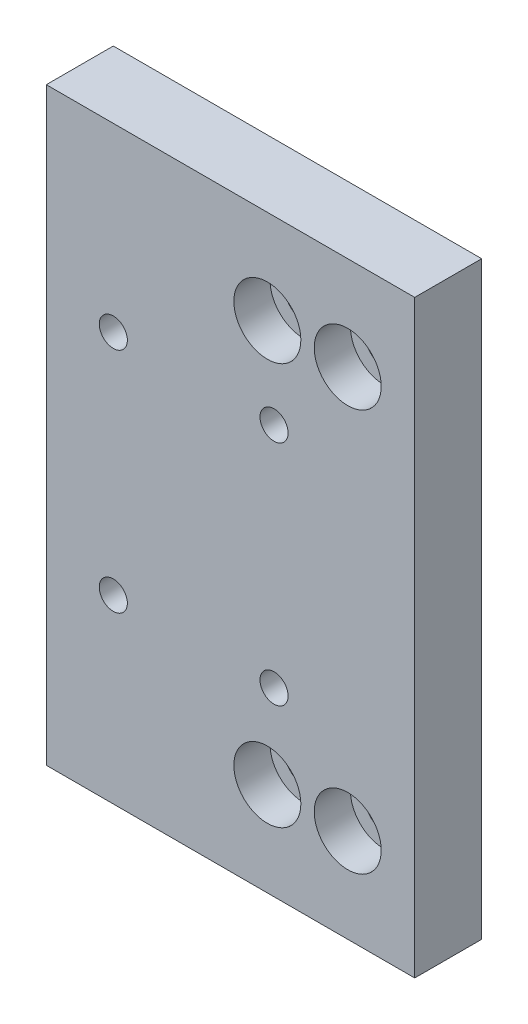
ISO-10303-21;
HEADER;
FILE_DESCRIPTION(('STEP AP214'),'2;1');
FILE_NAME('part.step','',(''),(''),'','','');
FILE_SCHEMA(('AUTOMOTIVE_DESIGN { 1 0 10303 214 1 1 1 1 }'));
ENDSEC;
DATA;
#1=APPLICATION_CONTEXT('core data for automotive mechanical design processes');
#2=APPLICATION_PROTOCOL_DEFINITION('international standard','automotive_design',2000,#1);
#3=PRODUCT_CONTEXT('',#1,'mechanical');
#4=PRODUCT('Part','Part','',(#3));
#5=PRODUCT_RELATED_PRODUCT_CATEGORY('part','',(#4));
#6=PRODUCT_DEFINITION_FORMATION('','',#4);
#7=PRODUCT_DEFINITION_CONTEXT('part definition',#1,'design');
#8=PRODUCT_DEFINITION('design','',#6,#7);
#9=PRODUCT_DEFINITION_SHAPE('','',#8);
#10=(LENGTH_UNIT() NAMED_UNIT(*) SI_UNIT(.MILLI.,.METRE.));
#11=(NAMED_UNIT(*) PLANE_ANGLE_UNIT() SI_UNIT($,.RADIAN.));
#12=(NAMED_UNIT(*) SI_UNIT($,.STERADIAN.) SOLID_ANGLE_UNIT());
#13=UNCERTAINTY_MEASURE_WITH_UNIT(LENGTH_MEASURE(1.E-05),#10,'distance_accuracy_value','');
#14=(GEOMETRIC_REPRESENTATION_CONTEXT(3) GLOBAL_UNCERTAINTY_ASSIGNED_CONTEXT((#13)) GLOBAL_UNIT_ASSIGNED_CONTEXT((#10,
#11,#12)) REPRESENTATION_CONTEXT('',''));
#15=CARTESIAN_POINT('',(0.,0.,0.));
#16=DIRECTION('',(0.,0.,1.));
#17=DIRECTION('',(1.,0.,0.));
#18=AXIS2_PLACEMENT_3D('',#15,#16,#17);
#19=CARTESIAN_POINT('',(27.5,44.,10.));
#20=DIRECTION('',(-1.,0.,0.));
#21=DIRECTION('',(0.,-1.,0.));
#22=AXIS2_PLACEMENT_3D('',#19,#20,#21);
#23=PLANE('',#22);
#24=DIRECTION('',(0.,1.,0.));
#25=VECTOR('',#24,1.);
#26=CARTESIAN_POINT('',(27.5,44.,0.));
#27=LINE('',#26,#25);
#28=CARTESIAN_POINT('',(27.5,-44.,0.));
#29=VERTEX_POINT('',#28);
#30=CARTESIAN_POINT('',(27.5,44.,0.));
#31=VERTEX_POINT('',#30);
#32=EDGE_CURVE('E115',#29,#31,#27,.T.);
#33=ORIENTED_EDGE('',*,*,#32,.T.);
#34=DIRECTION('',(0.,0.,-1.));
#35=VECTOR('',#34,1.);
#36=CARTESIAN_POINT('',(27.5,44.,10.));
#37=LINE('',#36,#35);
#38=CARTESIAN_POINT('',(27.5,44.,10.));
#39=VERTEX_POINT('',#38);
#40=EDGE_CURVE('E11',#39,#31,#37,.T.);
#41=ORIENTED_EDGE('',*,*,#40,.F.);
#42=DIRECTION('',(0.,1.,0.));
#43=VECTOR('',#42,1.);
#44=CARTESIAN_POINT('',(27.5,44.,10.));
#45=LINE('',#44,#43);
#46=CARTESIAN_POINT('',(27.5,-44.,10.));
#47=VERTEX_POINT('',#46);
#48=EDGE_CURVE('E99',#47,#39,#45,.T.);
#49=ORIENTED_EDGE('',*,*,#48,.F.);
#50=DIRECTION('',(0.,0.,-1.));
#51=VECTOR('',#50,1.);
#52=CARTESIAN_POINT('',(27.5,-44.,10.));
#53=LINE('',#52,#51);
#54=EDGE_CURVE('E111',#47,#29,#53,.T.);
#55=ORIENTED_EDGE('',*,*,#54,.T.);
#56=EDGE_LOOP('',(#33,#41,#49,#55));
#57=FACE_BOUND('',#56,.T.);
#58=ADVANCED_FACE('F47',(#57),#23,.F.);
#59=CARTESIAN_POINT('',(-27.5,44.,10.));
#60=DIRECTION('',(0.,-1.,0.));
#61=DIRECTION('',(0.,0.,-1.));
#62=AXIS2_PLACEMENT_3D('',#59,#60,#61);
#63=PLANE('',#62);
#64=DIRECTION('',(-1.,0.,0.));
#65=VECTOR('',#64,1.);
#66=CARTESIAN_POINT('',(-27.5,44.,0.));
#67=LINE('',#66,#65);
#68=CARTESIAN_POINT('',(-27.5,44.,0.));
#69=VERTEX_POINT('',#68);
#70=EDGE_CURVE('E104',#31,#69,#67,.T.);
#71=ORIENTED_EDGE('',*,*,#70,.T.);
#72=DIRECTION('',(0.,0.,-1.));
#73=VECTOR('',#72,1.);
#74=CARTESIAN_POINT('',(-27.5,44.,10.));
#75=LINE('',#74,#73);
#76=CARTESIAN_POINT('',(-27.5,44.,10.));
#77=VERTEX_POINT('',#76);
#78=EDGE_CURVE('E56',#77,#69,#75,.T.);
#79=ORIENTED_EDGE('',*,*,#78,.F.);
#80=DIRECTION('',(-1.,0.,0.));
#81=VECTOR('',#80,1.);
#82=CARTESIAN_POINT('',(-27.5,44.,10.));
#83=LINE('',#82,#81);
#84=EDGE_CURVE('E94',#39,#77,#83,.T.);
#85=ORIENTED_EDGE('',*,*,#84,.F.);
#86=ORIENTED_EDGE('',*,*,#40,.T.);
#87=EDGE_LOOP('',(#71,#79,#85,#86));
#88=FACE_BOUND('',#87,.T.);
#89=ADVANCED_FACE('F103',(#88),#63,.F.);
#90=CARTESIAN_POINT('',(-27.5,44.,10.));
#91=DIRECTION('',(1.,0.,0.));
#92=DIRECTION('',(0.,1.,0.));
#93=AXIS2_PLACEMENT_3D('',#90,#91,#92);
#94=PLANE('',#93);
#95=DIRECTION('',(0.,-1.,0.));
#96=VECTOR('',#95,1.);
#97=CARTESIAN_POINT('',(-27.5,44.,0.));
#98=LINE('',#97,#96);
#99=CARTESIAN_POINT('',(-27.5,-44.,0.));
#100=VERTEX_POINT('',#99);
#101=EDGE_CURVE('E81',#69,#100,#98,.T.);
#102=ORIENTED_EDGE('',*,*,#101,.T.);
#103=DIRECTION('',(0.,0.,-1.));
#104=VECTOR('',#103,1.);
#105=CARTESIAN_POINT('',(-27.5,-44.,10.));
#106=LINE('',#105,#104);
#107=CARTESIAN_POINT('',(-27.5,-44.,10.));
#108=VERTEX_POINT('',#107);
#109=EDGE_CURVE('E106',#108,#100,#106,.T.);
#110=ORIENTED_EDGE('',*,*,#109,.F.);
#111=DIRECTION('',(0.,-1.,0.));
#112=VECTOR('',#111,1.);
#113=CARTESIAN_POINT('',(-27.5,44.,10.));
#114=LINE('',#113,#112);
#115=EDGE_CURVE('E97',#77,#108,#114,.T.);
#116=ORIENTED_EDGE('',*,*,#115,.F.);
#117=ORIENTED_EDGE('',*,*,#78,.T.);
#118=EDGE_LOOP('',(#102,#110,#116,#117));
#119=FACE_BOUND('',#118,.T.);
#120=ADVANCED_FACE('F107',(#119),#94,.F.);
#121=CARTESIAN_POINT('',(-27.5,-44.,10.));
#122=DIRECTION('',(0.,1.,0.));
#123=DIRECTION('',(0.,0.,1.));
#124=AXIS2_PLACEMENT_3D('',#121,#122,#123);
#125=PLANE('',#124);
#126=DIRECTION('',(1.,0.,0.));
#127=VECTOR('',#126,1.);
#128=CARTESIAN_POINT('',(-27.5,-44.,0.));
#129=LINE('',#128,#127);
#130=EDGE_CURVE('E87',#100,#29,#129,.T.);
#131=ORIENTED_EDGE('',*,*,#130,.T.);
#132=ORIENTED_EDGE('',*,*,#54,.F.);
#133=DIRECTION('',(1.,0.,0.));
#134=VECTOR('',#133,1.);
#135=CARTESIAN_POINT('',(-27.5,-44.,10.));
#136=LINE('',#135,#134);
#137=EDGE_CURVE('E64',#108,#47,#136,.T.);
#138=ORIENTED_EDGE('',*,*,#137,.F.);
#139=ORIENTED_EDGE('',*,*,#109,.T.);
#140=EDGE_LOOP('',(#131,#132,#138,#139));
#141=FACE_BOUND('',#140,.T.);
#142=ADVANCED_FACE('F129',(#141),#125,.F.);
#143=CARTESIAN_POINT('',(0.,0.,10.));
#144=DIRECTION('',(0.,0.,1.));
#145=DIRECTION('',(1.,0.,0.));
#146=AXIS2_PLACEMENT_3D('',#143,#144,#145);
#147=PLANE('',#146);
#148=CARTESIAN_POINT('',(5.50000000000001,30.,10.));
#149=DIRECTION('',(0.,0.,1.));
#150=DIRECTION('',(1.,0.,0.));
#151=AXIS2_PLACEMENT_3D('',#148,#149,#150);
#152=CIRCLE('',#151,5.);
#153=CARTESIAN_POINT('',(10.5,30.,10.));
#154=VERTEX_POINT('',#153);
#155=EDGE_CURVE('E227',#154,#154,#152,.T.);
#156=ORIENTED_EDGE('',*,*,#155,.F.);
#157=EDGE_LOOP('',(#156));
#158=FACE_BOUND('',#157,.T.);
#159=CARTESIAN_POINT('',(17.5,30.,10.));
#160=DIRECTION('',(0.,0.,1.));
#161=DIRECTION('',(1.,0.,0.));
#162=AXIS2_PLACEMENT_3D('',#159,#160,#161);
#163=CIRCLE('',#162,5.);
#164=CARTESIAN_POINT('',(22.5,30.,10.));
#165=VERTEX_POINT('',#164);
#166=EDGE_CURVE('E211',#165,#165,#163,.T.);
#167=ORIENTED_EDGE('',*,*,#166,.F.);
#168=EDGE_LOOP('',(#167));
#169=FACE_BOUND('',#168,.T.);
#170=CARTESIAN_POINT('',(17.5,-30.,10.));
#171=DIRECTION('',(0.,0.,1.));
#172=DIRECTION('',(1.,0.,0.));
#173=AXIS2_PLACEMENT_3D('',#170,#171,#172);
#174=CIRCLE('',#173,5.);
#175=CARTESIAN_POINT('',(22.5,-30.,10.));
#176=VERTEX_POINT('',#175);
#177=EDGE_CURVE('E195',#176,#176,#174,.T.);
#178=ORIENTED_EDGE('',*,*,#177,.F.);
#179=EDGE_LOOP('',(#178));
#180=FACE_BOUND('',#179,.T.);
#181=CARTESIAN_POINT('',(5.50000000000001,-30.,10.));
#182=DIRECTION('',(0.,0.,1.));
#183=DIRECTION('',(1.,0.,0.));
#184=AXIS2_PLACEMENT_3D('',#181,#182,#183);
#185=CIRCLE('',#184,5.);
#186=CARTESIAN_POINT('',(10.5,-30.,10.));
#187=VERTEX_POINT('',#186);
#188=EDGE_CURVE('E179',#187,#187,#185,.T.);
#189=ORIENTED_EDGE('',*,*,#188,.F.);
#190=EDGE_LOOP('',(#189));
#191=FACE_BOUND('',#190,.T.);
#192=CARTESIAN_POINT('',(-17.5,17.,10.));
#193=DIRECTION('',(0.,0.,1.));
#194=DIRECTION('',(1.,0.,0.));
#195=AXIS2_PLACEMENT_3D('',#192,#193,#194);
#196=CIRCLE('',#195,2.09999999999999);
#197=CARTESIAN_POINT('',(-15.4,17.,10.));
#198=VERTEX_POINT('',#197);
#199=EDGE_CURVE('E163',#198,#198,#196,.T.);
#200=ORIENTED_EDGE('',*,*,#199,.F.);
#201=EDGE_LOOP('',(#200));
#202=FACE_BOUND('',#201,.T.);
#203=CARTESIAN_POINT('',(6.50000000000001,17.,10.));
#204=DIRECTION('',(0.,0.,1.));
#205=DIRECTION('',(1.,0.,0.));
#206=AXIS2_PLACEMENT_3D('',#203,#204,#205);
#207=CIRCLE('',#206,2.09999999999999);
#208=CARTESIAN_POINT('',(8.6,17.,10.));
#209=VERTEX_POINT('',#208);
#210=EDGE_CURVE('E155',#209,#209,#207,.T.);
#211=ORIENTED_EDGE('',*,*,#210,.F.);
#212=EDGE_LOOP('',(#211));
#213=FACE_BOUND('',#212,.T.);
#214=CARTESIAN_POINT('',(-17.5,-17.,10.));
#215=DIRECTION('',(0.,0.,1.));
#216=DIRECTION('',(1.,0.,0.));
#217=AXIS2_PLACEMENT_3D('',#214,#215,#216);
#218=CIRCLE('',#217,2.09999999999999);
#219=CARTESIAN_POINT('',(-15.4,-17.,10.));
#220=VERTEX_POINT('',#219);
#221=EDGE_CURVE('E147',#220,#220,#218,.T.);
#222=ORIENTED_EDGE('',*,*,#221,.F.);
#223=EDGE_LOOP('',(#222));
#224=FACE_BOUND('',#223,.T.);
#225=CARTESIAN_POINT('',(6.50000000000001,-17.,10.));
#226=DIRECTION('',(0.,0.,1.));
#227=DIRECTION('',(1.,0.,0.));
#228=AXIS2_PLACEMENT_3D('',#225,#226,#227);
#229=CIRCLE('',#228,2.09999999999999);
#230=CARTESIAN_POINT('',(8.6,-17.,10.));
#231=VERTEX_POINT('',#230);
#232=EDGE_CURVE('E139',#231,#231,#229,.T.);
#233=ORIENTED_EDGE('',*,*,#232,.F.);
#234=EDGE_LOOP('',(#233));
#235=FACE_BOUND('',#234,.T.);
#236=ORIENTED_EDGE('',*,*,#48,.T.);
#237=ORIENTED_EDGE('',*,*,#84,.T.);
#238=ORIENTED_EDGE('',*,*,#115,.T.);
#239=ORIENTED_EDGE('',*,*,#137,.T.);
#240=EDGE_LOOP('',(#236,#237,#238,#239));
#241=FACE_BOUND('',#240,.T.);
#242=ADVANCED_FACE('F95',(#158,#169,#180,#191,#202,#213,#224,#235,#241),#147,.T.);
#243=CARTESIAN_POINT('',(0.,0.,0.));
#244=DIRECTION('',(0.,0.,1.));
#245=DIRECTION('',(1.,0.,0.));
#246=AXIS2_PLACEMENT_3D('',#243,#244,#245);
#247=PLANE('',#246);
#248=CARTESIAN_POINT('',(5.50000000000001,30.,0.));
#249=DIRECTION('',(0.,0.,1.));
#250=DIRECTION('',(1.,0.,0.));
#251=AXIS2_PLACEMENT_3D('',#248,#249,#250);
#252=CIRCLE('',#251,2.75);
#253=CARTESIAN_POINT('',(8.25000000000001,30.,0.));
#254=VERTEX_POINT('',#253);
#255=EDGE_CURVE('E215',#254,#254,#252,.T.);
#256=ORIENTED_EDGE('',*,*,#255,.T.);
#257=EDGE_LOOP('',(#256));
#258=FACE_BOUND('',#257,.T.);
#259=CARTESIAN_POINT('',(17.5,30.,0.));
#260=DIRECTION('',(0.,0.,1.));
#261=DIRECTION('',(1.,0.,0.));
#262=AXIS2_PLACEMENT_3D('',#259,#260,#261);
#263=CIRCLE('',#262,2.75);
#264=CARTESIAN_POINT('',(20.25,30.,0.));
#265=VERTEX_POINT('',#264);
#266=EDGE_CURVE('E199',#265,#265,#263,.T.);
#267=ORIENTED_EDGE('',*,*,#266,.T.);
#268=EDGE_LOOP('',(#267));
#269=FACE_BOUND('',#268,.T.);
#270=CARTESIAN_POINT('',(17.5,-30.,0.));
#271=DIRECTION('',(0.,0.,1.));
#272=DIRECTION('',(1.,0.,0.));
#273=AXIS2_PLACEMENT_3D('',#270,#271,#272);
#274=CIRCLE('',#273,2.75);
#275=CARTESIAN_POINT('',(20.25,-30.,0.));
#276=VERTEX_POINT('',#275);
#277=EDGE_CURVE('E183',#276,#276,#274,.T.);
#278=ORIENTED_EDGE('',*,*,#277,.T.);
#279=EDGE_LOOP('',(#278));
#280=FACE_BOUND('',#279,.T.);
#281=CARTESIAN_POINT('',(5.50000000000001,-30.,0.));
#282=DIRECTION('',(0.,0.,1.));
#283=DIRECTION('',(1.,0.,0.));
#284=AXIS2_PLACEMENT_3D('',#281,#282,#283);
#285=CIRCLE('',#284,2.75);
#286=CARTESIAN_POINT('',(8.25000000000001,-30.,0.));
#287=VERTEX_POINT('',#286);
#288=EDGE_CURVE('E167',#287,#287,#285,.T.);
#289=ORIENTED_EDGE('',*,*,#288,.T.);
#290=EDGE_LOOP('',(#289));
#291=FACE_BOUND('',#290,.T.);
#292=CARTESIAN_POINT('',(-17.5,17.,0.));
#293=DIRECTION('',(0.,0.,1.));
#294=DIRECTION('',(1.,0.,0.));
#295=AXIS2_PLACEMENT_3D('',#292,#293,#294);
#296=CIRCLE('',#295,2.1);
#297=CARTESIAN_POINT('',(-15.4,17.,0.));
#298=VERTEX_POINT('',#297);
#299=EDGE_CURVE('E159',#298,#298,#296,.T.);
#300=ORIENTED_EDGE('',*,*,#299,.T.);
#301=EDGE_LOOP('',(#300));
#302=FACE_BOUND('',#301,.T.);
#303=CARTESIAN_POINT('',(6.50000000000001,17.,0.));
#304=DIRECTION('',(0.,0.,1.));
#305=DIRECTION('',(1.,0.,0.));
#306=AXIS2_PLACEMENT_3D('',#303,#304,#305);
#307=CIRCLE('',#306,2.1);
#308=CARTESIAN_POINT('',(8.60000000000001,17.,0.));
#309=VERTEX_POINT('',#308);
#310=EDGE_CURVE('E151',#309,#309,#307,.T.);
#311=ORIENTED_EDGE('',*,*,#310,.T.);
#312=EDGE_LOOP('',(#311));
#313=FACE_BOUND('',#312,.T.);
#314=CARTESIAN_POINT('',(-17.5,-17.,0.));
#315=DIRECTION('',(0.,0.,1.));
#316=DIRECTION('',(1.,0.,0.));
#317=AXIS2_PLACEMENT_3D('',#314,#315,#316);
#318=CIRCLE('',#317,2.1);
#319=CARTESIAN_POINT('',(-15.4,-17.,0.));
#320=VERTEX_POINT('',#319);
#321=EDGE_CURVE('E143',#320,#320,#318,.T.);
#322=ORIENTED_EDGE('',*,*,#321,.T.);
#323=EDGE_LOOP('',(#322));
#324=FACE_BOUND('',#323,.T.);
#325=CARTESIAN_POINT('',(6.50000000000001,-17.,0.));
#326=DIRECTION('',(0.,0.,1.));
#327=DIRECTION('',(1.,0.,0.));
#328=AXIS2_PLACEMENT_3D('',#325,#326,#327);
#329=CIRCLE('',#328,2.1);
#330=CARTESIAN_POINT('',(8.60000000000001,-17.,0.));
#331=VERTEX_POINT('',#330);
#332=EDGE_CURVE('E119',#331,#331,#329,.T.);
#333=ORIENTED_EDGE('',*,*,#332,.T.);
#334=EDGE_LOOP('',(#333));
#335=FACE_BOUND('',#334,.T.);
#336=ORIENTED_EDGE('',*,*,#32,.F.);
#337=ORIENTED_EDGE('',*,*,#130,.F.);
#338=ORIENTED_EDGE('',*,*,#101,.F.);
#339=ORIENTED_EDGE('',*,*,#70,.F.);
#340=EDGE_LOOP('',(#336,#337,#338,#339));
#341=FACE_BOUND('',#340,.T.);
#342=ADVANCED_FACE('F132',(#258,#269,#280,#291,#302,#313,#324,#335,#341),#247,.F.);
#343=CARTESIAN_POINT('',(6.50000000000001,-17.,10.));
#344=DIRECTION('',(0.,0.,1.));
#345=DIRECTION('',(1.,0.,0.));
#346=AXIS2_PLACEMENT_3D('',#343,#344,#345);
#347=CYLINDRICAL_SURFACE('',#346,2.09999999999999);
#348=ORIENTED_EDGE('',*,*,#332,.F.);
#349=EDGE_LOOP('',(#348));
#350=FACE_BOUND('',#349,.T.);
#351=ORIENTED_EDGE('',*,*,#232,.T.);
#352=EDGE_LOOP('',(#351));
#353=FACE_BOUND('',#352,.T.);
#354=ADVANCED_FACE('F251',(#350,#353),#347,.F.);
#355=CARTESIAN_POINT('',(-17.5,-17.,10.));
#356=DIRECTION('',(0.,0.,1.));
#357=DIRECTION('',(1.,0.,0.));
#358=AXIS2_PLACEMENT_3D('',#355,#356,#357);
#359=CYLINDRICAL_SURFACE('',#358,2.09999999999999);
#360=ORIENTED_EDGE('',*,*,#321,.F.);
#361=EDGE_LOOP('',(#360));
#362=FACE_BOUND('',#361,.T.);
#363=ORIENTED_EDGE('',*,*,#221,.T.);
#364=EDGE_LOOP('',(#363));
#365=FACE_BOUND('',#364,.T.);
#366=ADVANCED_FACE('F253',(#362,#365),#359,.F.);
#367=CARTESIAN_POINT('',(6.50000000000001,17.,10.));
#368=DIRECTION('',(0.,0.,1.));
#369=DIRECTION('',(1.,0.,0.));
#370=AXIS2_PLACEMENT_3D('',#367,#368,#369);
#371=CYLINDRICAL_SURFACE('',#370,2.09999999999999);
#372=ORIENTED_EDGE('',*,*,#310,.F.);
#373=EDGE_LOOP('',(#372));
#374=FACE_BOUND('',#373,.T.);
#375=ORIENTED_EDGE('',*,*,#210,.T.);
#376=EDGE_LOOP('',(#375));
#377=FACE_BOUND('',#376,.T.);
#378=ADVANCED_FACE('F260',(#374,#377),#371,.F.);
#379=CARTESIAN_POINT('',(-17.5,17.,10.));
#380=DIRECTION('',(0.,0.,1.));
#381=DIRECTION('',(1.,0.,0.));
#382=AXIS2_PLACEMENT_3D('',#379,#380,#381);
#383=CYLINDRICAL_SURFACE('',#382,2.09999999999999);
#384=ORIENTED_EDGE('',*,*,#299,.F.);
#385=EDGE_LOOP('',(#384));
#386=FACE_BOUND('',#385,.T.);
#387=ORIENTED_EDGE('',*,*,#199,.T.);
#388=EDGE_LOOP('',(#387));
#389=FACE_BOUND('',#388,.T.);
#390=ADVANCED_FACE('F304',(#386,#389),#383,.F.);
#391=CARTESIAN_POINT('',(5.50000000000001,-30.,10.));
#392=DIRECTION('',(0.,0.,1.));
#393=DIRECTION('',(1.,0.,0.));
#394=AXIS2_PLACEMENT_3D('',#391,#392,#393);
#395=CYLINDRICAL_SURFACE('',#394,2.75);
#396=ORIENTED_EDGE('',*,*,#288,.F.);
#397=EDGE_LOOP('',(#396));
#398=FACE_BOUND('',#397,.T.);
#399=CARTESIAN_POINT('',(5.50000000000001,-30.,4.6));
#400=DIRECTION('',(0.,0.,1.));
#401=DIRECTION('',(1.,0.,0.));
#402=AXIS2_PLACEMENT_3D('',#399,#400,#401);
#403=CIRCLE('',#402,2.75);
#404=CARTESIAN_POINT('',(8.25000000000001,-30.,4.6));
#405=VERTEX_POINT('',#404);
#406=EDGE_CURVE('E171',#405,#405,#403,.T.);
#407=ORIENTED_EDGE('',*,*,#406,.T.);
#408=EDGE_LOOP('',(#407));
#409=FACE_BOUND('',#408,.T.);
#410=ADVANCED_FACE('F298',(#398,#409),#395,.F.);
#411=CARTESIAN_POINT('',(8.25000000000001,-30.,4.6));
#412=DIRECTION('',(0.,0.,-1.));
#413=DIRECTION('',(-1.,0.,0.));
#414=AXIS2_PLACEMENT_3D('',#411,#412,#413);
#415=PLANE('',#414);
#416=ORIENTED_EDGE('',*,*,#406,.F.);
#417=EDGE_LOOP('',(#416));
#418=FACE_BOUND('',#417,.T.);
#419=CARTESIAN_POINT('',(5.50000000000001,-30.,4.6));
#420=DIRECTION('',(0.,0.,1.));
#421=DIRECTION('',(1.,0.,0.));
#422=AXIS2_PLACEMENT_3D('',#419,#420,#421);
#423=CIRCLE('',#422,5.);
#424=CARTESIAN_POINT('',(10.5,-30.,4.6));
#425=VERTEX_POINT('',#424);
#426=EDGE_CURVE('E175',#425,#425,#423,.T.);
#427=ORIENTED_EDGE('',*,*,#426,.T.);
#428=EDGE_LOOP('',(#427));
#429=FACE_BOUND('',#428,.T.);
#430=ADVANCED_FACE('F303',(#418,#429),#415,.F.);
#431=CARTESIAN_POINT('',(5.50000000000001,-30.,10.));
#432=DIRECTION('',(0.,0.,1.));
#433=DIRECTION('',(1.,0.,0.));
#434=AXIS2_PLACEMENT_3D('',#431,#432,#433);
#435=CYLINDRICAL_SURFACE('',#434,5.);
#436=ORIENTED_EDGE('',*,*,#426,.F.);
#437=EDGE_LOOP('',(#436));
#438=FACE_BOUND('',#437,.T.);
#439=ORIENTED_EDGE('',*,*,#188,.T.);
#440=EDGE_LOOP('',(#439));
#441=FACE_BOUND('',#440,.T.);
#442=ADVANCED_FACE('F317',(#438,#441),#435,.F.);
#443=CARTESIAN_POINT('',(17.5,-30.,10.));
#444=DIRECTION('',(0.,0.,1.));
#445=DIRECTION('',(1.,0.,0.));
#446=AXIS2_PLACEMENT_3D('',#443,#444,#445);
#447=CYLINDRICAL_SURFACE('',#446,2.75);
#448=ORIENTED_EDGE('',*,*,#277,.F.);
#449=EDGE_LOOP('',(#448));
#450=FACE_BOUND('',#449,.T.);
#451=CARTESIAN_POINT('',(17.5,-30.,4.6));
#452=DIRECTION('',(0.,0.,1.));
#453=DIRECTION('',(1.,0.,0.));
#454=AXIS2_PLACEMENT_3D('',#451,#452,#453);
#455=CIRCLE('',#454,2.75);
#456=CARTESIAN_POINT('',(20.25,-30.,4.6));
#457=VERTEX_POINT('',#456);
#458=EDGE_CURVE('E187',#457,#457,#455,.T.);
#459=ORIENTED_EDGE('',*,*,#458,.T.);
#460=EDGE_LOOP('',(#459));
#461=FACE_BOUND('',#460,.T.);
#462=ADVANCED_FACE('F328',(#450,#461),#447,.F.);
#463=CARTESIAN_POINT('',(20.25,-30.,4.6));
#464=DIRECTION('',(0.,0.,-1.));
#465=DIRECTION('',(-1.,0.,0.));
#466=AXIS2_PLACEMENT_3D('',#463,#464,#465);
#467=PLANE('',#466);
#468=ORIENTED_EDGE('',*,*,#458,.F.);
#469=EDGE_LOOP('',(#468));
#470=FACE_BOUND('',#469,.T.);
#471=CARTESIAN_POINT('',(17.5,-30.,4.6));
#472=DIRECTION('',(0.,0.,1.));
#473=DIRECTION('',(1.,0.,0.));
#474=AXIS2_PLACEMENT_3D('',#471,#472,#473);
#475=CIRCLE('',#474,5.);
#476=CARTESIAN_POINT('',(22.5,-30.,4.6));
#477=VERTEX_POINT('',#476);
#478=EDGE_CURVE('E191',#477,#477,#475,.T.);
#479=ORIENTED_EDGE('',*,*,#478,.T.);
#480=EDGE_LOOP('',(#479));
#481=FACE_BOUND('',#480,.T.);
#482=ADVANCED_FACE('F339',(#470,#481),#467,.F.);
#483=CARTESIAN_POINT('',(17.5,-30.,10.));
#484=DIRECTION('',(0.,0.,1.));
#485=DIRECTION('',(1.,0.,0.));
#486=AXIS2_PLACEMENT_3D('',#483,#484,#485);
#487=CYLINDRICAL_SURFACE('',#486,5.);
#488=ORIENTED_EDGE('',*,*,#478,.F.);
#489=EDGE_LOOP('',(#488));
#490=FACE_BOUND('',#489,.T.);
#491=ORIENTED_EDGE('',*,*,#177,.T.);
#492=EDGE_LOOP('',(#491));
#493=FACE_BOUND('',#492,.T.);
#494=ADVANCED_FACE('F350',(#490,#493),#487,.F.);
#495=CARTESIAN_POINT('',(17.5,30.,10.));
#496=DIRECTION('',(0.,0.,1.));
#497=DIRECTION('',(1.,0.,0.));
#498=AXIS2_PLACEMENT_3D('',#495,#496,#497);
#499=CYLINDRICAL_SURFACE('',#498,2.75);
#500=ORIENTED_EDGE('',*,*,#266,.F.);
#501=EDGE_LOOP('',(#500));
#502=FACE_BOUND('',#501,.T.);
#503=CARTESIAN_POINT('',(17.5,30.,4.6));
#504=DIRECTION('',(0.,0.,1.));
#505=DIRECTION('',(1.,0.,0.));
#506=AXIS2_PLACEMENT_3D('',#503,#504,#505);
#507=CIRCLE('',#506,2.75);
#508=CARTESIAN_POINT('',(20.25,30.,4.6));
#509=VERTEX_POINT('',#508);
#510=EDGE_CURVE('E203',#509,#509,#507,.T.);
#511=ORIENTED_EDGE('',*,*,#510,.T.);
#512=EDGE_LOOP('',(#511));
#513=FACE_BOUND('',#512,.T.);
#514=ADVANCED_FACE('F361',(#502,#513),#499,.F.);
#515=CARTESIAN_POINT('',(20.25,30.,4.6));
#516=DIRECTION('',(0.,0.,-1.));
#517=DIRECTION('',(-1.,0.,0.));
#518=AXIS2_PLACEMENT_3D('',#515,#516,#517);
#519=PLANE('',#518);
#520=ORIENTED_EDGE('',*,*,#510,.F.);
#521=EDGE_LOOP('',(#520));
#522=FACE_BOUND('',#521,.T.);
#523=CARTESIAN_POINT('',(17.5,30.,4.6));
#524=DIRECTION('',(0.,0.,1.));
#525=DIRECTION('',(1.,0.,0.));
#526=AXIS2_PLACEMENT_3D('',#523,#524,#525);
#527=CIRCLE('',#526,5.);
#528=CARTESIAN_POINT('',(22.5,30.,4.6));
#529=VERTEX_POINT('',#528);
#530=EDGE_CURVE('E207',#529,#529,#527,.T.);
#531=ORIENTED_EDGE('',*,*,#530,.T.);
#532=EDGE_LOOP('',(#531));
#533=FACE_BOUND('',#532,.T.);
#534=ADVANCED_FACE('F372',(#522,#533),#519,.F.);
#535=CARTESIAN_POINT('',(17.5,30.,10.));
#536=DIRECTION('',(0.,0.,1.));
#537=DIRECTION('',(1.,0.,0.));
#538=AXIS2_PLACEMENT_3D('',#535,#536,#537);
#539=CYLINDRICAL_SURFACE('',#538,5.);
#540=ORIENTED_EDGE('',*,*,#530,.F.);
#541=EDGE_LOOP('',(#540));
#542=FACE_BOUND('',#541,.T.);
#543=ORIENTED_EDGE('',*,*,#166,.T.);
#544=EDGE_LOOP('',(#543));
#545=FACE_BOUND('',#544,.T.);
#546=ADVANCED_FACE('F383',(#542,#545),#539,.F.);
#547=CARTESIAN_POINT('',(5.50000000000001,30.,10.));
#548=DIRECTION('',(0.,0.,1.));
#549=DIRECTION('',(1.,0.,0.));
#550=AXIS2_PLACEMENT_3D('',#547,#548,#549);
#551=CYLINDRICAL_SURFACE('',#550,2.75);
#552=ORIENTED_EDGE('',*,*,#255,.F.);
#553=EDGE_LOOP('',(#552));
#554=FACE_BOUND('',#553,.T.);
#555=CARTESIAN_POINT('',(5.50000000000001,30.,4.6));
#556=DIRECTION('',(0.,0.,1.));
#557=DIRECTION('',(1.,0.,0.));
#558=AXIS2_PLACEMENT_3D('',#555,#556,#557);
#559=CIRCLE('',#558,2.75);
#560=CARTESIAN_POINT('',(8.25000000000001,30.,4.6));
#561=VERTEX_POINT('',#560);
#562=EDGE_CURVE('E219',#561,#561,#559,.T.);
#563=ORIENTED_EDGE('',*,*,#562,.T.);
#564=EDGE_LOOP('',(#563));
#565=FACE_BOUND('',#564,.T.);
#566=ADVANCED_FACE('F394',(#554,#565),#551,.F.);
#567=CARTESIAN_POINT('',(8.25000000000001,30.,4.6));
#568=DIRECTION('',(0.,0.,-1.));
#569=DIRECTION('',(-1.,0.,0.));
#570=AXIS2_PLACEMENT_3D('',#567,#568,#569);
#571=PLANE('',#570);
#572=ORIENTED_EDGE('',*,*,#562,.F.);
#573=EDGE_LOOP('',(#572));
#574=FACE_BOUND('',#573,.T.);
#575=CARTESIAN_POINT('',(5.50000000000001,30.,4.6));
#576=DIRECTION('',(0.,0.,1.));
#577=DIRECTION('',(1.,0.,0.));
#578=AXIS2_PLACEMENT_3D('',#575,#576,#577);
#579=CIRCLE('',#578,5.);
#580=CARTESIAN_POINT('',(10.5,30.,4.6));
#581=VERTEX_POINT('',#580);
#582=EDGE_CURVE('E223',#581,#581,#579,.T.);
#583=ORIENTED_EDGE('',*,*,#582,.T.);
#584=EDGE_LOOP('',(#583));
#585=FACE_BOUND('',#584,.T.);
#586=ADVANCED_FACE('F405',(#574,#585),#571,.F.);
#587=CARTESIAN_POINT('',(5.50000000000001,30.,10.));
#588=DIRECTION('',(0.,0.,1.));
#589=DIRECTION('',(1.,0.,0.));
#590=AXIS2_PLACEMENT_3D('',#587,#588,#589);
#591=CYLINDRICAL_SURFACE('',#590,5.);
#592=ORIENTED_EDGE('',*,*,#582,.F.);
#593=EDGE_LOOP('',(#592));
#594=FACE_BOUND('',#593,.T.);
#595=ORIENTED_EDGE('',*,*,#155,.T.);
#596=EDGE_LOOP('',(#595));
#597=FACE_BOUND('',#596,.T.);
#598=ADVANCED_FACE('F232',(#594,#597),#591,.F.);
#599=CLOSED_SHELL('',(#58,#89,#120,#142,#242,#342,#354,#366,#378,#390,#410,#430,#442,#462,#482,
#494,#514,#534,#546,#566,#586,#598));
#600=MANIFOLD_SOLID_BREP('B2',#599);
#601=ADVANCED_BREP_SHAPE_REPRESENTATION('',(#18,#600),#14);
#602=SHAPE_DEFINITION_REPRESENTATION(#9,#601);
ENDSEC;
END-ISO-10303-21;
